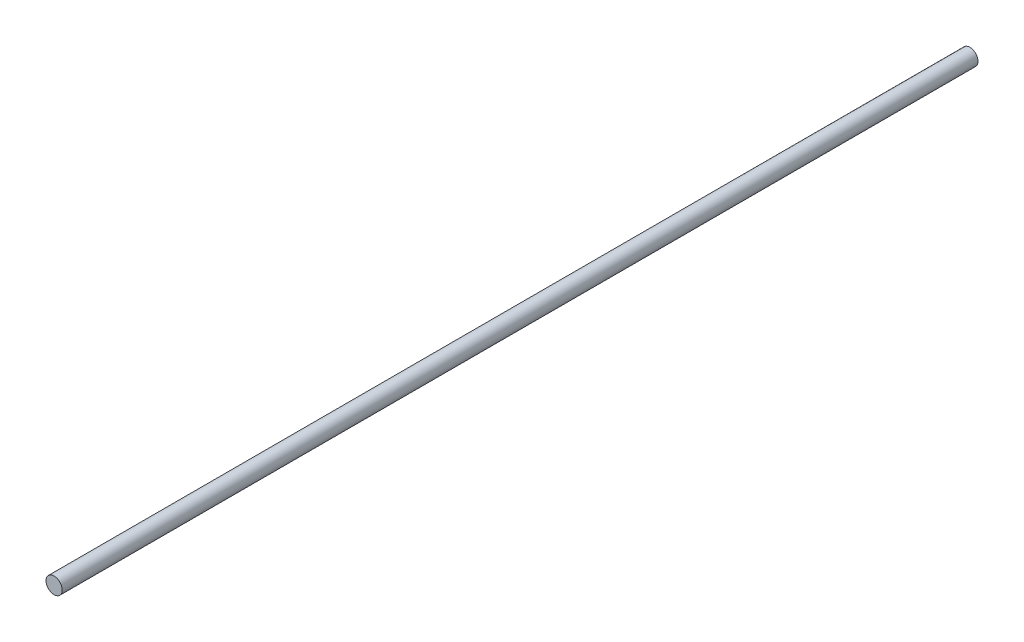
ISO-10303-21;
HEADER;
FILE_DESCRIPTION(('STEP AP214'),'2;1');
FILE_NAME('part.step','',(''),(''),'','','');
FILE_SCHEMA(('AUTOMOTIVE_DESIGN { 1 0 10303 214 1 1 1 1 }'));
ENDSEC;
DATA;
#1=APPLICATION_CONTEXT('core data for automotive mechanical design processes');
#2=APPLICATION_PROTOCOL_DEFINITION('international standard','automotive_design',2000,#1);
#3=PRODUCT_CONTEXT('',#1,'mechanical');
#4=PRODUCT('Part','Part','',(#3));
#5=PRODUCT_RELATED_PRODUCT_CATEGORY('part','',(#4));
#6=PRODUCT_DEFINITION_FORMATION('','',#4);
#7=PRODUCT_DEFINITION_CONTEXT('part definition',#1,'design');
#8=PRODUCT_DEFINITION('design','',#6,#7);
#9=PRODUCT_DEFINITION_SHAPE('','',#8);
#10=(LENGTH_UNIT() NAMED_UNIT(*) SI_UNIT(.MILLI.,.METRE.));
#11=(NAMED_UNIT(*) PLANE_ANGLE_UNIT() SI_UNIT($,.RADIAN.));
#12=(NAMED_UNIT(*) SI_UNIT($,.STERADIAN.) SOLID_ANGLE_UNIT());
#13=UNCERTAINTY_MEASURE_WITH_UNIT(LENGTH_MEASURE(1.E-05),#10,'distance_accuracy_value','');
#14=(GEOMETRIC_REPRESENTATION_CONTEXT(3) GLOBAL_UNCERTAINTY_ASSIGNED_CONTEXT((#13)) GLOBAL_UNIT_ASSIGNED_CONTEXT((#10,
#11,#12)) REPRESENTATION_CONTEXT('',''));
#15=CARTESIAN_POINT('',(0.,0.,0.));
#16=DIRECTION('',(0.,0.,1.));
#17=DIRECTION('',(1.,0.,0.));
#18=AXIS2_PLACEMENT_3D('',#15,#16,#17);
#19=CARTESIAN_POINT('',(0.,0.,113.));
#20=DIRECTION('',(0.,0.,-1.));
#21=DIRECTION('',(-1.,0.,0.));
#22=AXIS2_PLACEMENT_3D('',#19,#20,#21);
#23=CYLINDRICAL_SURFACE('',#22,2.);
#24=CARTESIAN_POINT('',(0.,0.,113.));
#25=DIRECTION('',(0.,0.,1.));
#26=DIRECTION('',(1.,0.,0.));
#27=AXIS2_PLACEMENT_3D('',#24,#25,#26);
#28=CIRCLE('',#27,2.);
#29=CARTESIAN_POINT('',(2.,0.,113.));
#30=VERTEX_POINT('',#29);
#31=EDGE_CURVE('E10',#30,#30,#28,.T.);
#32=ORIENTED_EDGE('',*,*,#31,.F.);
#33=EDGE_LOOP('',(#32));
#34=FACE_BOUND('',#33,.T.);
#35=CARTESIAN_POINT('',(0.,0.,-113.));
#36=DIRECTION('',(0.,0.,1.));
#37=DIRECTION('',(1.,0.,0.));
#38=AXIS2_PLACEMENT_3D('',#35,#36,#37);
#39=CIRCLE('',#38,2.);
#40=CARTESIAN_POINT('',(2.,0.,-113.));
#41=VERTEX_POINT('',#40);
#42=EDGE_CURVE('E37',#41,#41,#39,.T.);
#43=ORIENTED_EDGE('',*,*,#42,.T.);
#44=EDGE_LOOP('',(#43));
#45=FACE_BOUND('',#44,.T.);
#46=ADVANCED_FACE('F34',(#34,#45),#23,.T.);
#47=CARTESIAN_POINT('',(0.,0.,113.));
#48=DIRECTION('',(0.,0.,1.));
#49=DIRECTION('',(1.,0.,0.));
#50=AXIS2_PLACEMENT_3D('',#47,#48,#49);
#51=PLANE('',#50);
#52=ORIENTED_EDGE('',*,*,#31,.T.);
#53=EDGE_LOOP('',(#52));
#54=FACE_BOUND('',#53,.T.);
#55=ADVANCED_FACE('F49',(#54),#51,.T.);
#56=CARTESIAN_POINT('',(0.,0.,-113.));
#57=DIRECTION('',(0.,0.,1.));
#58=DIRECTION('',(1.,0.,0.));
#59=AXIS2_PLACEMENT_3D('',#56,#57,#58);
#60=PLANE('',#59);
#61=ORIENTED_EDGE('',*,*,#42,.F.);
#62=EDGE_LOOP('',(#61));
#63=FACE_BOUND('',#62,.T.);
#64=ADVANCED_FACE('F47',(#63),#60,.F.);
#65=CLOSED_SHELL('',(#46,#55,#64));
#66=MANIFOLD_SOLID_BREP('B2',#65);
#67=ADVANCED_BREP_SHAPE_REPRESENTATION('',(#18,#66),#14);
#68=SHAPE_DEFINITION_REPRESENTATION(#9,#67);
ENDSEC;
END-ISO-10303-21;
